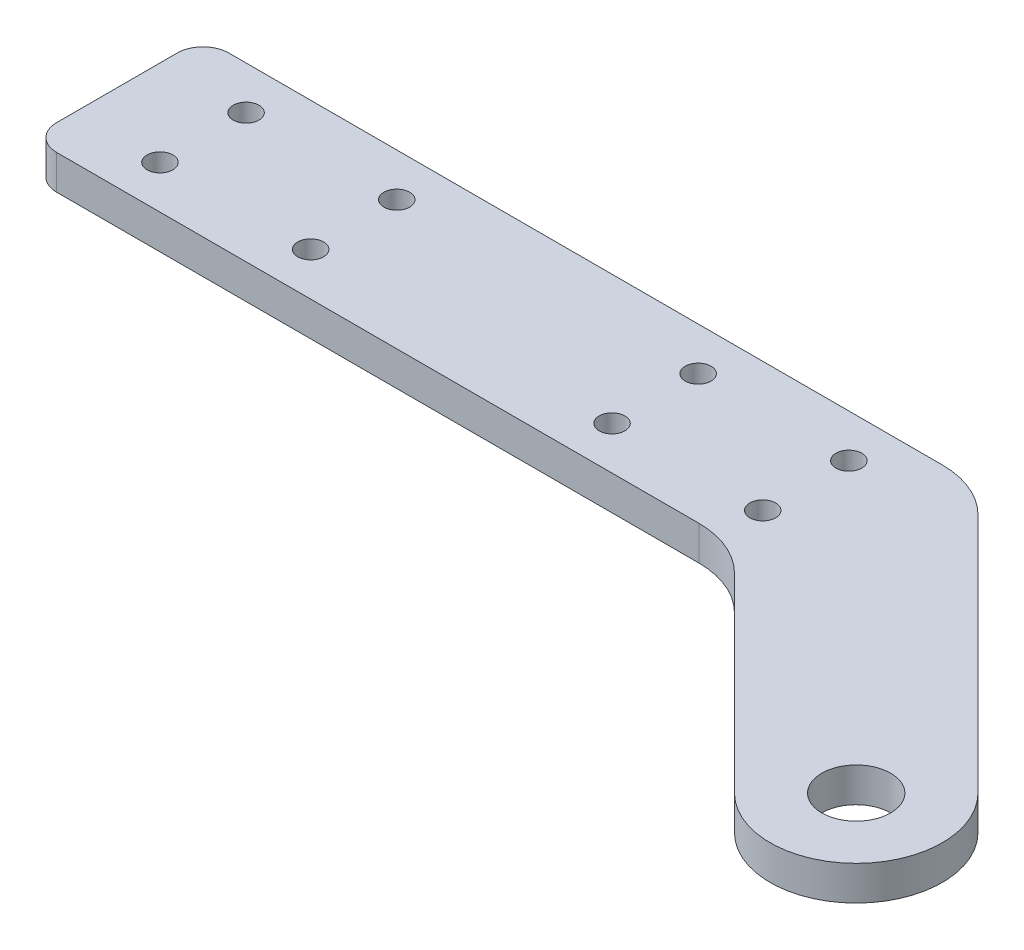
ISO-10303-21;
HEADER;
FILE_DESCRIPTION(('STEP AP214'),'2;1');
FILE_NAME('part.step','',(''),(''),'','','');
FILE_SCHEMA(('AUTOMOTIVE_DESIGN { 1 0 10303 214 1 1 1 1 }'));
ENDSEC;
DATA;
#1=APPLICATION_CONTEXT('core data for automotive mechanical design processes');
#2=APPLICATION_PROTOCOL_DEFINITION('international standard','automotive_design',2000,#1);
#3=PRODUCT_CONTEXT('',#1,'mechanical');
#4=PRODUCT('Part','Part','',(#3));
#5=PRODUCT_RELATED_PRODUCT_CATEGORY('part','',(#4));
#6=PRODUCT_DEFINITION_FORMATION('','',#4);
#7=PRODUCT_DEFINITION_CONTEXT('part definition',#1,'design');
#8=PRODUCT_DEFINITION('design','',#6,#7);
#9=PRODUCT_DEFINITION_SHAPE('','',#8);
#10=(LENGTH_UNIT() NAMED_UNIT(*) SI_UNIT(.MILLI.,.METRE.));
#11=(NAMED_UNIT(*) PLANE_ANGLE_UNIT() SI_UNIT($,.RADIAN.));
#12=(NAMED_UNIT(*) SI_UNIT($,.STERADIAN.) SOLID_ANGLE_UNIT());
#13=UNCERTAINTY_MEASURE_WITH_UNIT(LENGTH_MEASURE(1.E-05),#10,'distance_accuracy_value','');
#14=(GEOMETRIC_REPRESENTATION_CONTEXT(3) GLOBAL_UNCERTAINTY_ASSIGNED_CONTEXT((#13)) GLOBAL_UNIT_ASSIGNED_CONTEXT((#10,
#11,#12)) REPRESENTATION_CONTEXT('',''));
#15=CARTESIAN_POINT('',(0.,0.,0.));
#16=DIRECTION('',(0.,0.,1.));
#17=DIRECTION('',(1.,0.,0.));
#18=AXIS2_PLACEMENT_3D('',#15,#16,#17);
#19=CARTESIAN_POINT('',(93.8578643762687,4.,38.));
#20=DIRECTION('',(0.,-1.,0.));
#21=DIRECTION('',(0.,0.,-1.));
#22=AXIS2_PLACEMENT_3D('',#19,#20,#21);
#23=CYLINDRICAL_SURFACE('',#22,9.99999999999999);
#24=CARTESIAN_POINT('',(93.8578643762687,0.,38.));
#25=DIRECTION('',(0.,1.,0.));
#26=DIRECTION('',(0.,0.,1.));
#27=AXIS2_PLACEMENT_3D('',#24,#25,#26);
#28=CIRCLE('',#27,9.99999999999999);
#29=CARTESIAN_POINT('',(86.7867965644032,0.,45.0710678118654));
#30=VERTEX_POINT('',#29);
#31=CARTESIAN_POINT('',(100.928932188134,0.,30.9289321881346));
#32=VERTEX_POINT('',#31);
#33=EDGE_CURVE('E141',#30,#32,#28,.T.);
#34=ORIENTED_EDGE('',*,*,#33,.T.);
#35=DIRECTION('',(0.,-1.,0.));
#36=VECTOR('',#35,1.);
#37=CARTESIAN_POINT('',(100.928932188134,4.,30.9289321881346));
#38=LINE('',#37,#36);
#39=CARTESIAN_POINT('',(100.928932188134,4.,30.9289321881346));
#40=VERTEX_POINT('',#39);
#41=EDGE_CURVE('E123',#40,#32,#38,.T.);
#42=ORIENTED_EDGE('',*,*,#41,.F.);
#43=CARTESIAN_POINT('',(93.8578643762687,4.,38.));
#44=DIRECTION('',(0.,1.,0.));
#45=DIRECTION('',(0.,0.,1.));
#46=AXIS2_PLACEMENT_3D('',#43,#44,#45);
#47=CIRCLE('',#46,9.99999999999999);
#48=CARTESIAN_POINT('',(86.7867965644032,4.,45.0710678118654));
#49=VERTEX_POINT('',#48);
#50=EDGE_CURVE('E132',#49,#40,#47,.T.);
#51=ORIENTED_EDGE('',*,*,#50,.F.);
#52=DIRECTION('',(0.,-1.,0.));
#53=VECTOR('',#52,1.);
#54=CARTESIAN_POINT('',(86.7867965644032,4.,45.0710678118654));
#55=LINE('',#54,#53);
#56=EDGE_CURVE('E143',#49,#30,#55,.T.);
#57=ORIENTED_EDGE('',*,*,#56,.T.);
#58=EDGE_LOOP('',(#34,#42,#51,#57));
#59=FACE_BOUND('',#58,.T.);
#60=ADVANCED_FACE('F43',(#59),#23,.T.);
#61=CARTESIAN_POINT('',(35.0000000000004,4.,-35.));
#62=DIRECTION('',(-0.707106781186552,0.,0.707106781186544));
#63=DIRECTION('',(0.707106781186544,0.,0.707106781186551));
#64=AXIS2_PLACEMENT_3D('',#61,#62,#63);
#65=PLANE('',#64);
#66=DIRECTION('',(-0.707106781186544,0.,-0.707106781186551));
#67=VECTOR('',#66,1.);
#68=CARTESIAN_POINT('',(35.0000000000004,0.,-35.));
#69=LINE('',#68,#67);
#70=CARTESIAN_POINT('',(72.9289321881345,0.,2.92893218813457));
#71=VERTEX_POINT('',#70);
#72=EDGE_CURVE('E205',#32,#71,#69,.T.);
#73=ORIENTED_EDGE('',*,*,#72,.T.);
#74=DIRECTION('',(0.,-1.,0.));
#75=VECTOR('',#74,1.);
#76=CARTESIAN_POINT('',(72.9289321881345,4.,2.92893218813457));
#77=LINE('',#76,#75);
#78=CARTESIAN_POINT('',(72.9289321881345,4.,2.92893218813457));
#79=VERTEX_POINT('',#78);
#80=EDGE_CURVE('E130',#71,#79,#77,.F.);
#81=ORIENTED_EDGE('',*,*,#80,.T.);
#82=DIRECTION('',(-0.707106781186544,0.,-0.707106781186551));
#83=VECTOR('',#82,1.);
#84=CARTESIAN_POINT('',(35.0000000000004,4.,-35.));
#85=LINE('',#84,#83);
#86=EDGE_CURVE('E119',#40,#79,#85,.T.);
#87=ORIENTED_EDGE('',*,*,#86,.F.);
#88=ORIENTED_EDGE('',*,*,#41,.T.);
#89=EDGE_LOOP('',(#73,#81,#87,#88));
#90=FACE_BOUND('',#89,.T.);
#91=ADVANCED_FACE('F124',(#90),#65,.F.);
#92=CARTESIAN_POINT('',(0.,4.,0.));
#93=DIRECTION('',(0.,0.,-1.));
#94=DIRECTION('',(-1.,0.,0.));
#95=AXIS2_PLACEMENT_3D('',#92,#93,#94);
#96=PLANE('',#95);
#97=DIRECTION('',(0.,-1.,0.));
#98=VECTOR('',#97,1.);
#99=CARTESIAN_POINT('',(-17.,4.,0.));
#100=LINE('',#99,#98);
#101=CARTESIAN_POINT('',(-17.,0.,0.));
#102=VERTEX_POINT('',#101);
#103=CARTESIAN_POINT('',(-17.,4.,0.));
#104=VERTEX_POINT('',#103);
#105=EDGE_CURVE('E158',#102,#104,#100,.F.);
#106=ORIENTED_EDGE('',*,*,#105,.T.);
#107=DIRECTION('',(1.,0.,0.));
#108=VECTOR('',#107,1.);
#109=CARTESIAN_POINT('',(0.,4.,0.));
#110=LINE('',#109,#108);
#111=CARTESIAN_POINT('',(65.857864376269,4.,0.));
#112=VERTEX_POINT('',#111);
#113=EDGE_CURVE('E127',#104,#112,#110,.T.);
#114=ORIENTED_EDGE('',*,*,#113,.T.);
#115=DIRECTION('',(0.,-1.,0.));
#116=VECTOR('',#115,1.);
#117=CARTESIAN_POINT('',(65.857864376269,0.,0.));
#118=LINE('',#117,#116);
#119=CARTESIAN_POINT('',(65.857864376269,0.,0.));
#120=VERTEX_POINT('',#119);
#121=EDGE_CURVE('E167',#112,#120,#118,.T.);
#122=ORIENTED_EDGE('',*,*,#121,.T.);
#123=DIRECTION('',(1.,0.,0.));
#124=VECTOR('',#123,1.);
#125=CARTESIAN_POINT('',(0.,0.,0.));
#126=LINE('',#125,#124);
#127=EDGE_CURVE('E206',#102,#120,#126,.T.);
#128=ORIENTED_EDGE('',*,*,#127,.F.);
#129=EDGE_LOOP('',(#106,#114,#122,#128));
#130=FACE_BOUND('',#129,.T.);
#131=ADVANCED_FACE('F234',(#130),#96,.T.);
#132=CARTESIAN_POINT('',(-20.,4.,0.));
#133=DIRECTION('',(1.,0.,0.));
#134=DIRECTION('',(0.,0.,-1.));
#135=AXIS2_PLACEMENT_3D('',#132,#133,#134);
#136=PLANE('',#135);
#137=DIRECTION('',(0.,0.,1.));
#138=VECTOR('',#137,1.);
#139=CARTESIAN_POINT('',(-20.,4.,0.));
#140=LINE('',#139,#138);
#141=CARTESIAN_POINT('',(-20.,4.,3.));
#142=VERTEX_POINT('',#141);
#143=CARTESIAN_POINT('',(-20.,4.,17.));
#144=VERTEX_POINT('',#143);
#145=EDGE_CURVE('E196',#142,#144,#140,.T.);
#146=ORIENTED_EDGE('',*,*,#145,.F.);
#147=DIRECTION('',(0.,-1.,0.));
#148=VECTOR('',#147,1.);
#149=CARTESIAN_POINT('',(-20.,0.,3.));
#150=LINE('',#149,#148);
#151=CARTESIAN_POINT('',(-20.,0.,3.));
#152=VERTEX_POINT('',#151);
#153=EDGE_CURVE('E165',#142,#152,#150,.T.);
#154=ORIENTED_EDGE('',*,*,#153,.T.);
#155=DIRECTION('',(0.,0.,1.));
#156=VECTOR('',#155,1.);
#157=CARTESIAN_POINT('',(-20.,0.,0.));
#158=LINE('',#157,#156);
#159=CARTESIAN_POINT('',(-20.,0.,17.));
#160=VERTEX_POINT('',#159);
#161=EDGE_CURVE('E191',#152,#160,#158,.T.);
#162=ORIENTED_EDGE('',*,*,#161,.T.);
#163=DIRECTION('',(0.,-1.,0.));
#164=VECTOR('',#163,1.);
#165=CARTESIAN_POINT('',(-20.,4.,17.));
#166=LINE('',#165,#164);
#167=EDGE_CURVE('E162',#160,#144,#166,.F.);
#168=ORIENTED_EDGE('',*,*,#167,.T.);
#169=EDGE_LOOP('',(#146,#154,#162,#168));
#170=FACE_BOUND('',#169,.T.);
#171=ADVANCED_FACE('F433',(#170),#136,.F.);
#172=CARTESIAN_POINT('',(0.,4.,20.));
#173=DIRECTION('',(0.,0.,-1.));
#174=DIRECTION('',(-1.,0.,0.));
#175=AXIS2_PLACEMENT_3D('',#172,#173,#174);
#176=PLANE('',#175);
#177=DIRECTION('',(1.,0.,0.));
#178=VECTOR('',#177,1.);
#179=CARTESIAN_POINT('',(0.,0.,20.));
#180=LINE('',#179,#178);
#181=CARTESIAN_POINT('',(-17.,0.,20.));
#182=VERTEX_POINT('',#181);
#183=CARTESIAN_POINT('',(57.573593128807,0.,20.));
#184=VERTEX_POINT('',#183);
#185=EDGE_CURVE('E187',#182,#184,#180,.T.);
#186=ORIENTED_EDGE('',*,*,#185,.T.);
#187=DIRECTION('',(0.,-1.,0.));
#188=VECTOR('',#187,1.);
#189=CARTESIAN_POINT('',(57.573593128807,4.,20.));
#190=LINE('',#189,#188);
#191=CARTESIAN_POINT('',(57.573593128807,4.,20.));
#192=VERTEX_POINT('',#191);
#193=EDGE_CURVE('E63',#184,#192,#190,.F.);
#194=ORIENTED_EDGE('',*,*,#193,.T.);
#195=DIRECTION('',(1.,0.,0.));
#196=VECTOR('',#195,1.);
#197=CARTESIAN_POINT('',(0.,4.,20.));
#198=LINE('',#197,#196);
#199=CARTESIAN_POINT('',(-17.,4.,20.));
#200=VERTEX_POINT('',#199);
#201=EDGE_CURVE('E197',#200,#192,#198,.T.);
#202=ORIENTED_EDGE('',*,*,#201,.F.);
#203=DIRECTION('',(0.,-1.,0.));
#204=VECTOR('',#203,1.);
#205=CARTESIAN_POINT('',(-17.,4.,20.));
#206=LINE('',#205,#204);
#207=EDGE_CURVE('E170',#200,#182,#206,.T.);
#208=ORIENTED_EDGE('',*,*,#207,.T.);
#209=EDGE_LOOP('',(#186,#194,#202,#208));
#210=FACE_BOUND('',#209,.T.);
#211=ADVANCED_FACE('F188',(#210),#176,.F.);
#212=CARTESIAN_POINT('',(20.8578643762693,4.,-20.8578643762691));
#213=DIRECTION('',(0.707106781186551,0.,-0.707106781186544));
#214=DIRECTION('',(-0.707106781186544,0.,-0.707106781186551));
#215=AXIS2_PLACEMENT_3D('',#212,#213,#214);
#216=PLANE('',#215);
#217=DIRECTION('',(0.707106781186544,0.,0.707106781186551));
#218=VECTOR('',#217,1.);
#219=CARTESIAN_POINT('',(20.8578643762693,4.,-20.8578643762691));
#220=LINE('',#219,#218);
#221=CARTESIAN_POINT('',(64.6446609406726,4.,22.9289321881346));
#222=VERTEX_POINT('',#221);
#223=EDGE_CURVE('E136',#222,#49,#220,.T.);
#224=ORIENTED_EDGE('',*,*,#223,.F.);
#225=DIRECTION('',(0.,-1.,0.));
#226=VECTOR('',#225,1.);
#227=CARTESIAN_POINT('',(64.6446609406726,0.,22.9289321881346));
#228=LINE('',#227,#226);
#229=CARTESIAN_POINT('',(64.6446609406726,0.,22.9289321881346));
#230=VERTEX_POINT('',#229);
#231=EDGE_CURVE('E178',#222,#230,#228,.T.);
#232=ORIENTED_EDGE('',*,*,#231,.T.);
#233=DIRECTION('',(0.707106781186544,0.,0.707106781186551));
#234=VECTOR('',#233,1.);
#235=CARTESIAN_POINT('',(20.8578643762693,0.,-20.8578643762691));
#236=LINE('',#235,#234);
#237=EDGE_CURVE('E190',#230,#30,#236,.T.);
#238=ORIENTED_EDGE('',*,*,#237,.T.);
#239=ORIENTED_EDGE('',*,*,#56,.F.);
#240=EDGE_LOOP('',(#224,#232,#238,#239));
#241=FACE_BOUND('',#240,.T.);
#242=ADVANCED_FACE('F192',(#241),#216,.F.);
#243=CARTESIAN_POINT('',(93.8578643762687,4.,38.));
#244=DIRECTION('',(0.,-1.,0.));
#245=DIRECTION('',(0.,0.,-1.));
#246=AXIS2_PLACEMENT_3D('',#243,#244,#245);
#247=CYLINDRICAL_SURFACE('',#246,4.00000000000005);
#248=CARTESIAN_POINT('',(93.8578643762687,4.,38.));
#249=DIRECTION('',(0.,1.,0.));
#250=DIRECTION('',(0.,0.,1.));
#251=AXIS2_PLACEMENT_3D('',#248,#249,#250);
#252=CIRCLE('',#251,4.00000000000005);
#253=CARTESIAN_POINT('',(93.8578643762687,4.,42.));
#254=VERTEX_POINT('',#253);
#255=EDGE_CURVE('E148',#254,#254,#252,.T.);
#256=ORIENTED_EDGE('',*,*,#255,.T.);
#257=EDGE_LOOP('',(#256));
#258=FACE_BOUND('',#257,.T.);
#259=CARTESIAN_POINT('',(93.8578643762687,0.,38.));
#260=DIRECTION('',(0.,1.,0.));
#261=DIRECTION('',(0.,0.,1.));
#262=AXIS2_PLACEMENT_3D('',#259,#260,#261);
#263=CIRCLE('',#262,4.00000000000005);
#264=CARTESIAN_POINT('',(93.8578643762687,0.,42.));
#265=VERTEX_POINT('',#264);
#266=EDGE_CURVE('E140',#265,#265,#263,.T.);
#267=ORIENTED_EDGE('',*,*,#266,.F.);
#268=EDGE_LOOP('',(#267));
#269=FACE_BOUND('',#268,.T.);
#270=ADVANCED_FACE('F220',(#258,#269),#247,.F.);
#271=CARTESIAN_POINT('',(0.,4.,0.));
#272=DIRECTION('',(0.,1.,0.));
#273=DIRECTION('',(0.,0.,1.));
#274=AXIS2_PLACEMENT_3D('',#271,#272,#273);
#275=PLANE('',#274);
#276=ORIENTED_EDGE('',*,*,#113,.F.);
#277=CARTESIAN_POINT('',(-17.,4.,3.));
#278=DIRECTION('',(0.,1.,0.));
#279=DIRECTION('',(0.,0.,1.));
#280=AXIS2_PLACEMENT_3D('',#277,#278,#279);
#281=CIRCLE('',#280,3.);
#282=EDGE_CURVE('E157',#104,#142,#281,.T.);
#283=ORIENTED_EDGE('',*,*,#282,.T.);
#284=ORIENTED_EDGE('',*,*,#145,.T.);
#285=CARTESIAN_POINT('',(-17.,4.,17.));
#286=DIRECTION('',(0.,1.,0.));
#287=DIRECTION('',(0.,0.,1.));
#288=AXIS2_PLACEMENT_3D('',#285,#286,#287);
#289=CIRCLE('',#288,3.);
#290=EDGE_CURVE('E151',#144,#200,#289,.T.);
#291=ORIENTED_EDGE('',*,*,#290,.T.);
#292=ORIENTED_EDGE('',*,*,#201,.T.);
#293=CARTESIAN_POINT('',(57.573593128807,4.,30.));
#294=DIRECTION('',(0.,1.,0.));
#295=DIRECTION('',(0.,0.,1.));
#296=AXIS2_PLACEMENT_3D('',#293,#294,#295);
#297=CIRCLE('',#296,10.);
#298=EDGE_CURVE('E11',#192,#222,#297,.F.);
#299=ORIENTED_EDGE('',*,*,#298,.T.);
#300=ORIENTED_EDGE('',*,*,#223,.T.);
#301=ORIENTED_EDGE('',*,*,#50,.T.);
#302=ORIENTED_EDGE('',*,*,#86,.T.);
#303=CARTESIAN_POINT('',(65.857864376269,4.,10.));
#304=DIRECTION('',(0.,1.,0.));
#305=DIRECTION('',(0.,0.,1.));
#306=AXIS2_PLACEMENT_3D('',#303,#304,#305);
#307=CIRCLE('',#306,10.);
#308=EDGE_CURVE('E176',#79,#112,#307,.T.);
#309=ORIENTED_EDGE('',*,*,#308,.T.);
#310=EDGE_LOOP('',(#276,#283,#284,#291,#292,#299,#300,#301,#302,#309));
#311=FACE_BOUND('',#310,.T.);
#312=CARTESIAN_POINT('',(42.5,4.,5.));
#313=DIRECTION('',(0.,1.,0.));
#314=DIRECTION('',(0.,0.,1.));
#315=AXIS2_PLACEMENT_3D('',#312,#313,#314);
#316=CIRCLE('',#315,1.5);
#317=CARTESIAN_POINT('',(42.5,4.,6.5));
#318=VERTEX_POINT('',#317);
#319=EDGE_CURVE('E207',#318,#318,#316,.T.);
#320=ORIENTED_EDGE('',*,*,#319,.F.);
#321=EDGE_LOOP('',(#320));
#322=FACE_BOUND('',#321,.T.);
#323=CARTESIAN_POINT('',(-10.,4.,5.00000000000002));
#324=DIRECTION('',(0.,1.,0.));
#325=DIRECTION('',(0.,0.,-1.));
#326=AXIS2_PLACEMENT_3D('',#323,#324,#325);
#327=CIRCLE('',#326,1.5);
#328=CARTESIAN_POINT('',(-10.,4.,3.50000000000002));
#329=VERTEX_POINT('',#328);
#330=EDGE_CURVE('E290',#329,#329,#327,.T.);
#331=ORIENTED_EDGE('',*,*,#330,.F.);
#332=EDGE_LOOP('',(#331));
#333=FACE_BOUND('',#332,.T.);
#334=CARTESIAN_POINT('',(-10.,4.,15.));
#335=DIRECTION('',(0.,1.,0.));
#336=DIRECTION('',(0.,0.,-1.));
#337=AXIS2_PLACEMENT_3D('',#334,#335,#336);
#338=CIRCLE('',#337,1.5);
#339=CARTESIAN_POINT('',(-10.,4.,13.5));
#340=VERTEX_POINT('',#339);
#341=EDGE_CURVE('E300',#340,#340,#338,.T.);
#342=ORIENTED_EDGE('',*,*,#341,.F.);
#343=EDGE_LOOP('',(#342));
#344=FACE_BOUND('',#343,.T.);
#345=CARTESIAN_POINT('',(60.,4.,15.));
#346=DIRECTION('',(0.,1.,0.));
#347=DIRECTION('',(0.,0.,1.));
#348=AXIS2_PLACEMENT_3D('',#345,#346,#347);
#349=CIRCLE('',#348,1.5);
#350=CARTESIAN_POINT('',(60.,4.,16.5));
#351=VERTEX_POINT('',#350);
#352=EDGE_CURVE('E271',#351,#351,#349,.T.);
#353=ORIENTED_EDGE('',*,*,#352,.F.);
#354=EDGE_LOOP('',(#353));
#355=FACE_BOUND('',#354,.T.);
#356=CARTESIAN_POINT('',(60.,4.,5.));
#357=DIRECTION('',(0.,1.,0.));
#358=DIRECTION('',(0.,0.,1.));
#359=AXIS2_PLACEMENT_3D('',#356,#357,#358);
#360=CIRCLE('',#359,1.5);
#361=CARTESIAN_POINT('',(60.,4.,6.5));
#362=VERTEX_POINT('',#361);
#363=EDGE_CURVE('E266',#362,#362,#360,.T.);
#364=ORIENTED_EDGE('',*,*,#363,.F.);
#365=EDGE_LOOP('',(#364));
#366=FACE_BOUND('',#365,.T.);
#367=CARTESIAN_POINT('',(7.49999999999997,4.,5.));
#368=DIRECTION('',(0.,1.,0.));
#369=DIRECTION('',(0.,0.,-1.));
#370=AXIS2_PLACEMENT_3D('',#367,#368,#369);
#371=CIRCLE('',#370,1.5);
#372=CARTESIAN_POINT('',(7.49999999999997,4.,3.5));
#373=VERTEX_POINT('',#372);
#374=EDGE_CURVE('E274',#373,#373,#371,.T.);
#375=ORIENTED_EDGE('',*,*,#374,.F.);
#376=EDGE_LOOP('',(#375));
#377=FACE_BOUND('',#376,.T.);
#378=CARTESIAN_POINT('',(7.49999999999997,4.,15.));
#379=DIRECTION('',(0.,1.,0.));
#380=DIRECTION('',(0.,0.,-1.));
#381=AXIS2_PLACEMENT_3D('',#378,#379,#380);
#382=CIRCLE('',#381,1.5);
#383=CARTESIAN_POINT('',(7.49999999999997,4.,13.5));
#384=VERTEX_POINT('',#383);
#385=EDGE_CURVE('E277',#384,#384,#382,.T.);
#386=ORIENTED_EDGE('',*,*,#385,.F.);
#387=EDGE_LOOP('',(#386));
#388=FACE_BOUND('',#387,.T.);
#389=CARTESIAN_POINT('',(42.5,4.,15.));
#390=DIRECTION('',(0.,1.,0.));
#391=DIRECTION('',(0.,0.,1.));
#392=AXIS2_PLACEMENT_3D('',#389,#390,#391);
#393=CIRCLE('',#392,1.5);
#394=CARTESIAN_POINT('',(42.5,4.,16.5));
#395=VERTEX_POINT('',#394);
#396=EDGE_CURVE('E261',#395,#395,#393,.T.);
#397=ORIENTED_EDGE('',*,*,#396,.F.);
#398=EDGE_LOOP('',(#397));
#399=FACE_BOUND('',#398,.T.);
#400=ORIENTED_EDGE('',*,*,#255,.F.);
#401=EDGE_LOOP('',(#400));
#402=FACE_BOUND('',#401,.T.);
#403=ADVANCED_FACE('F134',(#311,#322,#333,#344,#355,#366,#377,#388,#399,#402),#275,.T.);
#404=CARTESIAN_POINT('',(0.,0.,0.));
#405=DIRECTION('',(0.,1.,0.));
#406=DIRECTION('',(0.,0.,1.));
#407=AXIS2_PLACEMENT_3D('',#404,#405,#406);
#408=PLANE('',#407);
#409=CARTESIAN_POINT('',(-17.,0.,3.));
#410=DIRECTION('',(0.,1.,0.));
#411=DIRECTION('',(0.,0.,1.));
#412=AXIS2_PLACEMENT_3D('',#409,#410,#411);
#413=CIRCLE('',#412,3.);
#414=EDGE_CURVE('E146',#152,#102,#413,.F.);
#415=ORIENTED_EDGE('',*,*,#414,.T.);
#416=ORIENTED_EDGE('',*,*,#127,.T.);
#417=CARTESIAN_POINT('',(65.857864376269,0.,10.));
#418=DIRECTION('',(0.,1.,0.));
#419=DIRECTION('',(0.,0.,1.));
#420=AXIS2_PLACEMENT_3D('',#417,#418,#419);
#421=CIRCLE('',#420,10.);
#422=EDGE_CURVE('E173',#120,#71,#421,.F.);
#423=ORIENTED_EDGE('',*,*,#422,.T.);
#424=ORIENTED_EDGE('',*,*,#72,.F.);
#425=ORIENTED_EDGE('',*,*,#33,.F.);
#426=ORIENTED_EDGE('',*,*,#237,.F.);
#427=CARTESIAN_POINT('',(57.573593128807,0.,30.));
#428=DIRECTION('',(0.,1.,0.));
#429=DIRECTION('',(0.,0.,1.));
#430=AXIS2_PLACEMENT_3D('',#427,#428,#429);
#431=CIRCLE('',#430,10.);
#432=EDGE_CURVE('E51',#230,#184,#431,.T.);
#433=ORIENTED_EDGE('',*,*,#432,.T.);
#434=ORIENTED_EDGE('',*,*,#185,.F.);
#435=CARTESIAN_POINT('',(-17.,0.,17.));
#436=DIRECTION('',(0.,1.,0.));
#437=DIRECTION('',(0.,0.,1.));
#438=AXIS2_PLACEMENT_3D('',#435,#436,#437);
#439=CIRCLE('',#438,3.);
#440=EDGE_CURVE('E144',#182,#160,#439,.F.);
#441=ORIENTED_EDGE('',*,*,#440,.T.);
#442=ORIENTED_EDGE('',*,*,#161,.F.);
#443=EDGE_LOOP('',(#415,#416,#423,#424,#425,#426,#433,#434,#441,#442));
#444=FACE_BOUND('',#443,.T.);
#445=CARTESIAN_POINT('',(42.5,0.,5.));
#446=DIRECTION('',(0.,1.,0.));
#447=DIRECTION('',(0.,0.,1.));
#448=AXIS2_PLACEMENT_3D('',#445,#446,#447);
#449=CIRCLE('',#448,1.5);
#450=CARTESIAN_POINT('',(42.5,0.,6.5));
#451=VERTEX_POINT('',#450);
#452=EDGE_CURVE('E265',#451,#451,#449,.F.);
#453=ORIENTED_EDGE('',*,*,#452,.F.);
#454=EDGE_LOOP('',(#453));
#455=FACE_BOUND('',#454,.T.);
#456=CARTESIAN_POINT('',(-10.,0.,5.00000000000002));
#457=DIRECTION('',(0.,1.,0.));
#458=DIRECTION('',(0.,0.,1.));
#459=AXIS2_PLACEMENT_3D('',#456,#457,#458);
#460=CIRCLE('',#459,1.5);
#461=CARTESIAN_POINT('',(-10.,0.,6.50000000000002));
#462=VERTEX_POINT('',#461);
#463=EDGE_CURVE('E295',#462,#462,#460,.F.);
#464=ORIENTED_EDGE('',*,*,#463,.F.);
#465=EDGE_LOOP('',(#464));
#466=FACE_BOUND('',#465,.T.);
#467=CARTESIAN_POINT('',(-10.,0.,15.));
#468=DIRECTION('',(0.,1.,0.));
#469=DIRECTION('',(0.,0.,1.));
#470=AXIS2_PLACEMENT_3D('',#467,#468,#469);
#471=CIRCLE('',#470,1.5);
#472=CARTESIAN_POINT('',(-10.,0.,16.5));
#473=VERTEX_POINT('',#472);
#474=EDGE_CURVE('E291',#473,#473,#471,.F.);
#475=ORIENTED_EDGE('',*,*,#474,.F.);
#476=EDGE_LOOP('',(#475));
#477=FACE_BOUND('',#476,.T.);
#478=CARTESIAN_POINT('',(60.,0.,15.));
#479=DIRECTION('',(0.,1.,0.));
#480=DIRECTION('',(0.,0.,1.));
#481=AXIS2_PLACEMENT_3D('',#478,#479,#480);
#482=CIRCLE('',#481,1.5);
#483=CARTESIAN_POINT('',(60.,0.,16.5));
#484=VERTEX_POINT('',#483);
#485=EDGE_CURVE('E297',#484,#484,#482,.F.);
#486=ORIENTED_EDGE('',*,*,#485,.F.);
#487=EDGE_LOOP('',(#486));
#488=FACE_BOUND('',#487,.T.);
#489=CARTESIAN_POINT('',(60.,0.,5.));
#490=DIRECTION('',(0.,1.,0.));
#491=DIRECTION('',(0.,0.,1.));
#492=AXIS2_PLACEMENT_3D('',#489,#490,#491);
#493=CIRCLE('',#492,1.5);
#494=CARTESIAN_POINT('',(60.,0.,6.5));
#495=VERTEX_POINT('',#494);
#496=EDGE_CURVE('E270',#495,#495,#493,.F.);
#497=ORIENTED_EDGE('',*,*,#496,.F.);
#498=EDGE_LOOP('',(#497));
#499=FACE_BOUND('',#498,.T.);
#500=CARTESIAN_POINT('',(7.49999999999997,0.,5.));
#501=DIRECTION('',(0.,1.,0.));
#502=DIRECTION('',(0.,0.,1.));
#503=AXIS2_PLACEMENT_3D('',#500,#501,#502);
#504=CIRCLE('',#503,1.5);
#505=CARTESIAN_POINT('',(7.49999999999997,0.,6.5));
#506=VERTEX_POINT('',#505);
#507=EDGE_CURVE('E268',#506,#506,#504,.F.);
#508=ORIENTED_EDGE('',*,*,#507,.F.);
#509=EDGE_LOOP('',(#508));
#510=FACE_BOUND('',#509,.T.);
#511=CARTESIAN_POINT('',(7.49999999999997,0.,15.));
#512=DIRECTION('',(0.,1.,0.));
#513=DIRECTION('',(0.,0.,1.));
#514=AXIS2_PLACEMENT_3D('',#511,#512,#513);
#515=CIRCLE('',#514,1.5);
#516=CARTESIAN_POINT('',(7.49999999999997,0.,16.5));
#517=VERTEX_POINT('',#516);
#518=EDGE_CURVE('E276',#517,#517,#515,.F.);
#519=ORIENTED_EDGE('',*,*,#518,.F.);
#520=EDGE_LOOP('',(#519));
#521=FACE_BOUND('',#520,.T.);
#522=CARTESIAN_POINT('',(42.5,0.,15.));
#523=DIRECTION('',(0.,1.,0.));
#524=DIRECTION('',(0.,0.,1.));
#525=AXIS2_PLACEMENT_3D('',#522,#523,#524);
#526=CIRCLE('',#525,1.5);
#527=CARTESIAN_POINT('',(42.5,0.,16.5));
#528=VERTEX_POINT('',#527);
#529=EDGE_CURVE('E283',#528,#528,#526,.F.);
#530=ORIENTED_EDGE('',*,*,#529,.F.);
#531=EDGE_LOOP('',(#530));
#532=FACE_BOUND('',#531,.T.);
#533=ORIENTED_EDGE('',*,*,#266,.T.);
#534=EDGE_LOOP('',(#533));
#535=FACE_BOUND('',#534,.T.);
#536=ADVANCED_FACE('F183',(#444,#455,#466,#477,#488,#499,#510,#521,#532,#535),#408,.F.);
#537=CARTESIAN_POINT('',(42.5,-0.00100000000000013,15.));
#538=DIRECTION('',(0.,1.,0.));
#539=DIRECTION('',(0.,0.,1.));
#540=AXIS2_PLACEMENT_3D('',#537,#538,#539);
#541=CYLINDRICAL_SURFACE('',#540,1.5);
#542=ORIENTED_EDGE('',*,*,#396,.T.);
#543=EDGE_LOOP('',(#542));
#544=FACE_BOUND('',#543,.T.);
#545=ORIENTED_EDGE('',*,*,#529,.T.);
#546=EDGE_LOOP('',(#545));
#547=FACE_BOUND('',#546,.T.);
#548=ADVANCED_FACE('F315',(#544,#547),#541,.F.);
#549=CARTESIAN_POINT('',(7.49999999999997,-0.00100000000000013,15.));
#550=DIRECTION('',(0.,1.,0.));
#551=DIRECTION('',(0.,0.,1.));
#552=AXIS2_PLACEMENT_3D('',#549,#550,#551);
#553=CYLINDRICAL_SURFACE('',#552,1.5);
#554=ORIENTED_EDGE('',*,*,#385,.T.);
#555=EDGE_LOOP('',(#554));
#556=FACE_BOUND('',#555,.T.);
#557=ORIENTED_EDGE('',*,*,#518,.T.);
#558=EDGE_LOOP('',(#557));
#559=FACE_BOUND('',#558,.T.);
#560=ADVANCED_FACE('F324',(#556,#559),#553,.F.);
#561=CARTESIAN_POINT('',(7.49999999999997,-0.00100000000000013,5.));
#562=DIRECTION('',(0.,1.,0.));
#563=DIRECTION('',(0.,0.,1.));
#564=AXIS2_PLACEMENT_3D('',#561,#562,#563);
#565=CYLINDRICAL_SURFACE('',#564,1.5);
#566=ORIENTED_EDGE('',*,*,#374,.T.);
#567=EDGE_LOOP('',(#566));
#568=FACE_BOUND('',#567,.T.);
#569=ORIENTED_EDGE('',*,*,#507,.T.);
#570=EDGE_LOOP('',(#569));
#571=FACE_BOUND('',#570,.T.);
#572=ADVANCED_FACE('F330',(#568,#571),#565,.F.);
#573=CARTESIAN_POINT('',(60.,-0.00100000000000013,5.));
#574=DIRECTION('',(0.,1.,0.));
#575=DIRECTION('',(0.,0.,1.));
#576=AXIS2_PLACEMENT_3D('',#573,#574,#575);
#577=CYLINDRICAL_SURFACE('',#576,1.5);
#578=ORIENTED_EDGE('',*,*,#363,.T.);
#579=EDGE_LOOP('',(#578));
#580=FACE_BOUND('',#579,.T.);
#581=ORIENTED_EDGE('',*,*,#496,.T.);
#582=EDGE_LOOP('',(#581));
#583=FACE_BOUND('',#582,.T.);
#584=ADVANCED_FACE('F337',(#580,#583),#577,.F.);
#585=CARTESIAN_POINT('',(60.,-0.00100000000000013,15.));
#586=DIRECTION('',(0.,1.,0.));
#587=DIRECTION('',(0.,0.,1.));
#588=AXIS2_PLACEMENT_3D('',#585,#586,#587);
#589=CYLINDRICAL_SURFACE('',#588,1.5);
#590=ORIENTED_EDGE('',*,*,#352,.T.);
#591=EDGE_LOOP('',(#590));
#592=FACE_BOUND('',#591,.T.);
#593=ORIENTED_EDGE('',*,*,#485,.T.);
#594=EDGE_LOOP('',(#593));
#595=FACE_BOUND('',#594,.T.);
#596=ADVANCED_FACE('F308',(#592,#595),#589,.F.);
#597=CARTESIAN_POINT('',(-10.,-0.00100000000000013,15.));
#598=DIRECTION('',(0.,1.,0.));
#599=DIRECTION('',(0.,0.,1.));
#600=AXIS2_PLACEMENT_3D('',#597,#598,#599);
#601=CYLINDRICAL_SURFACE('',#600,1.5);
#602=ORIENTED_EDGE('',*,*,#341,.T.);
#603=EDGE_LOOP('',(#602));
#604=FACE_BOUND('',#603,.T.);
#605=ORIENTED_EDGE('',*,*,#474,.T.);
#606=EDGE_LOOP('',(#605));
#607=FACE_BOUND('',#606,.T.);
#608=ADVANCED_FACE('F350',(#604,#607),#601,.F.);
#609=CARTESIAN_POINT('',(-10.,-0.00100000000000013,5.00000000000002));
#610=DIRECTION('',(0.,1.,0.));
#611=DIRECTION('',(0.,0.,1.));
#612=AXIS2_PLACEMENT_3D('',#609,#610,#611);
#613=CYLINDRICAL_SURFACE('',#612,1.5);
#614=ORIENTED_EDGE('',*,*,#330,.T.);
#615=EDGE_LOOP('',(#614));
#616=FACE_BOUND('',#615,.T.);
#617=ORIENTED_EDGE('',*,*,#463,.T.);
#618=EDGE_LOOP('',(#617));
#619=FACE_BOUND('',#618,.T.);
#620=ADVANCED_FACE('F331',(#616,#619),#613,.F.);
#621=CARTESIAN_POINT('',(42.5,-0.00100000000000013,5.));
#622=DIRECTION('',(0.,1.,0.));
#623=DIRECTION('',(0.,0.,1.));
#624=AXIS2_PLACEMENT_3D('',#621,#622,#623);
#625=CYLINDRICAL_SURFACE('',#624,1.5);
#626=ORIENTED_EDGE('',*,*,#319,.T.);
#627=EDGE_LOOP('',(#626));
#628=FACE_BOUND('',#627,.T.);
#629=ORIENTED_EDGE('',*,*,#452,.T.);
#630=EDGE_LOOP('',(#629));
#631=FACE_BOUND('',#630,.T.);
#632=ADVANCED_FACE('F245',(#628,#631),#625,.F.);
#633=CARTESIAN_POINT('',(-17.,4.,3.));
#634=DIRECTION('',(0.,1.,0.));
#635=DIRECTION('',(0.,0.,1.));
#636=AXIS2_PLACEMENT_3D('',#633,#634,#635);
#637=CYLINDRICAL_SURFACE('',#636,3.);
#638=ORIENTED_EDGE('',*,*,#282,.F.);
#639=ORIENTED_EDGE('',*,*,#105,.F.);
#640=ORIENTED_EDGE('',*,*,#414,.F.);
#641=ORIENTED_EDGE('',*,*,#153,.F.);
#642=EDGE_LOOP('',(#638,#639,#640,#641));
#643=FACE_BOUND('',#642,.T.);
#644=ADVANCED_FACE('F238',(#643),#637,.T.);
#645=CARTESIAN_POINT('',(-17.,4.,17.));
#646=DIRECTION('',(0.,-1.,0.));
#647=DIRECTION('',(0.,0.,-1.));
#648=AXIS2_PLACEMENT_3D('',#645,#646,#647);
#649=CYLINDRICAL_SURFACE('',#648,3.);
#650=ORIENTED_EDGE('',*,*,#290,.F.);
#651=ORIENTED_EDGE('',*,*,#167,.F.);
#652=ORIENTED_EDGE('',*,*,#440,.F.);
#653=ORIENTED_EDGE('',*,*,#207,.F.);
#654=EDGE_LOOP('',(#650,#651,#652,#653));
#655=FACE_BOUND('',#654,.T.);
#656=ADVANCED_FACE('F241',(#655),#649,.T.);
#657=CARTESIAN_POINT('',(65.857864376269,4.,10.));
#658=DIRECTION('',(0.,1.,0.));
#659=DIRECTION('',(0.,0.,1.));
#660=AXIS2_PLACEMENT_3D('',#657,#658,#659);
#661=CYLINDRICAL_SURFACE('',#660,10.);
#662=ORIENTED_EDGE('',*,*,#308,.F.);
#663=ORIENTED_EDGE('',*,*,#80,.F.);
#664=ORIENTED_EDGE('',*,*,#422,.F.);
#665=ORIENTED_EDGE('',*,*,#121,.F.);
#666=EDGE_LOOP('',(#662,#663,#664,#665));
#667=FACE_BOUND('',#666,.T.);
#668=ADVANCED_FACE('F244',(#667),#661,.T.);
#669=CARTESIAN_POINT('',(57.573593128807,4.,30.));
#670=DIRECTION('',(0.,1.,0.));
#671=DIRECTION('',(0.,0.,1.));
#672=AXIS2_PLACEMENT_3D('',#669,#670,#671);
#673=CYLINDRICAL_SURFACE('',#672,10.);
#674=ORIENTED_EDGE('',*,*,#298,.F.);
#675=ORIENTED_EDGE('',*,*,#193,.F.);
#676=ORIENTED_EDGE('',*,*,#432,.F.);
#677=ORIENTED_EDGE('',*,*,#231,.F.);
#678=EDGE_LOOP('',(#674,#675,#676,#677));
#679=FACE_BOUND('',#678,.T.);
#680=ADVANCED_FACE('F44',(#679),#673,.F.);
#681=CLOSED_SHELL('',(#60,#91,#131,#171,#211,#242,#270,#403,#536,#548,#560,#572,#584,#596,#608,
#620,#632,#644,#656,#668,#680));
#682=MANIFOLD_SOLID_BREP('B2',#681);
#683=ADVANCED_BREP_SHAPE_REPRESENTATION('',(#18,#682),#14);
#684=SHAPE_DEFINITION_REPRESENTATION(#9,#683);
ENDSEC;
END-ISO-10303-21;
